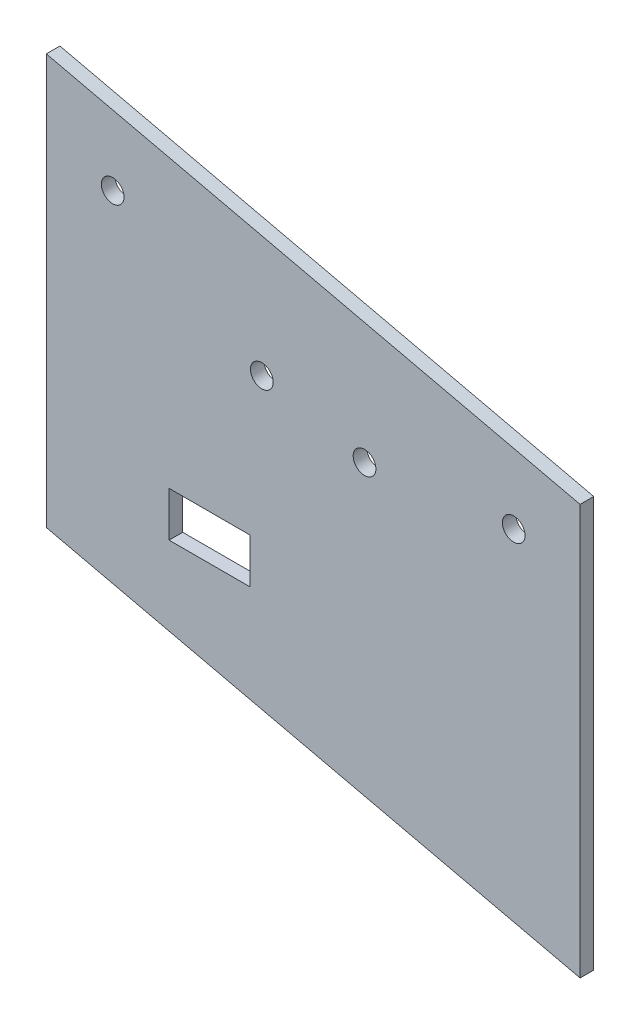
ISO-10303-21;
HEADER;
FILE_DESCRIPTION(('STEP AP214'),'2;1');
FILE_NAME('part.step','',(''),(''),'','','');
FILE_SCHEMA(('AUTOMOTIVE_DESIGN { 1 0 10303 214 1 1 1 1 }'));
ENDSEC;
DATA;
#1=APPLICATION_CONTEXT('core data for automotive mechanical design processes');
#2=APPLICATION_PROTOCOL_DEFINITION('international standard','automotive_design',2000,#1);
#3=PRODUCT_CONTEXT('',#1,'mechanical');
#4=PRODUCT('Part','Part','',(#3));
#5=PRODUCT_RELATED_PRODUCT_CATEGORY('part','',(#4));
#6=PRODUCT_DEFINITION_FORMATION('','',#4);
#7=PRODUCT_DEFINITION_CONTEXT('part definition',#1,'design');
#8=PRODUCT_DEFINITION('design','',#6,#7);
#9=PRODUCT_DEFINITION_SHAPE('','',#8);
#10=(LENGTH_UNIT() NAMED_UNIT(*) SI_UNIT(.MILLI.,.METRE.));
#11=(NAMED_UNIT(*) PLANE_ANGLE_UNIT() SI_UNIT($,.RADIAN.));
#12=(NAMED_UNIT(*) SI_UNIT($,.STERADIAN.) SOLID_ANGLE_UNIT());
#13=UNCERTAINTY_MEASURE_WITH_UNIT(LENGTH_MEASURE(1.E-05),#10,'distance_accuracy_value','');
#14=(GEOMETRIC_REPRESENTATION_CONTEXT(3) GLOBAL_UNCERTAINTY_ASSIGNED_CONTEXT((#13)) GLOBAL_UNIT_ASSIGNED_CONTEXT((#10,
#11,#12)) REPRESENTATION_CONTEXT('',''));
#15=CARTESIAN_POINT('',(0.,0.,0.));
#16=DIRECTION('',(0.,0.,1.));
#17=DIRECTION('',(1.,0.,0.));
#18=AXIS2_PLACEMENT_3D('',#15,#16,#17);
#19=CARTESIAN_POINT('',(117.509029813099,63.1709028461303,3.));
#20=DIRECTION('',(-0.224951054343861,-0.974370064785236,0.));
#21=DIRECTION('',(0.974370064785236,-0.224951054343861,0.));
#22=AXIS2_PLACEMENT_3D('',#19,#20,#21);
#23=PLANE('',#22);
#24=DIRECTION('',(-0.974370064785236,0.224951054343861,0.));
#25=VECTOR('',#24,1.);
#26=CARTESIAN_POINT('',(117.509029813099,63.1709028461303,0.));
#27=LINE('',#26,#25);
#28=CARTESIAN_POINT('',(117.509029813099,63.1709028461303,0.));
#29=VERTEX_POINT('',#28);
#30=CARTESIAN_POINT('',(0.,90.3,0.));
#31=VERTEX_POINT('',#30);
#32=EDGE_CURVE('E163',#29,#31,#27,.T.);
#33=ORIENTED_EDGE('',*,*,#32,.T.);
#34=DIRECTION('',(0.,0.,-1.));
#35=VECTOR('',#34,1.);
#36=CARTESIAN_POINT('',(0.,90.3,3.));
#37=LINE('',#36,#35);
#38=CARTESIAN_POINT('',(0.,90.3,3.));
#39=VERTEX_POINT('',#38);
#40=EDGE_CURVE('E11',#39,#31,#37,.T.);
#41=ORIENTED_EDGE('',*,*,#40,.F.);
#42=DIRECTION('',(-0.974370064785236,0.224951054343861,0.));
#43=VECTOR('',#42,1.);
#44=CARTESIAN_POINT('',(117.509029813099,63.1709028461303,3.));
#45=LINE('',#44,#43);
#46=CARTESIAN_POINT('',(117.509029813099,63.1709028461303,3.));
#47=VERTEX_POINT('',#46);
#48=EDGE_CURVE('E164',#47,#39,#45,.T.);
#49=ORIENTED_EDGE('',*,*,#48,.F.);
#50=DIRECTION('',(0.,0.,-1.));
#51=VECTOR('',#50,1.);
#52=CARTESIAN_POINT('',(117.509029813099,63.1709028461303,3.));
#53=LINE('',#52,#51);
#54=EDGE_CURVE('E174',#47,#29,#53,.T.);
#55=ORIENTED_EDGE('',*,*,#54,.T.);
#56=EDGE_LOOP('',(#33,#41,#49,#55));
#57=FACE_BOUND('',#56,.T.);
#58=ADVANCED_FACE('F39',(#57),#23,.F.);
#59=CARTESIAN_POINT('',(0.,90.3,3.));
#60=DIRECTION('',(1.,0.,0.));
#61=DIRECTION('',(0.,1.,0.));
#62=AXIS2_PLACEMENT_3D('',#59,#60,#61);
#63=PLANE('',#62);
#64=DIRECTION('',(0.,-1.,0.));
#65=VECTOR('',#64,1.);
#66=CARTESIAN_POINT('',(0.,90.3,0.));
#67=LINE('',#66,#65);
#68=CARTESIAN_POINT('',(0.,0.,0.));
#69=VERTEX_POINT('',#68);
#70=EDGE_CURVE('E177',#31,#69,#67,.T.);
#71=ORIENTED_EDGE('',*,*,#70,.T.);
#72=DIRECTION('',(0.,0.,-1.));
#73=VECTOR('',#72,1.);
#74=CARTESIAN_POINT('',(0.,0.,3.));
#75=LINE('',#74,#73);
#76=CARTESIAN_POINT('',(0.,0.,3.));
#77=VERTEX_POINT('',#76);
#78=EDGE_CURVE('E46',#77,#69,#75,.T.);
#79=ORIENTED_EDGE('',*,*,#78,.F.);
#80=DIRECTION('',(0.,-1.,0.));
#81=VECTOR('',#80,1.);
#82=CARTESIAN_POINT('',(0.,90.3,3.));
#83=LINE('',#82,#81);
#84=EDGE_CURVE('E167',#39,#77,#83,.T.);
#85=ORIENTED_EDGE('',*,*,#84,.F.);
#86=ORIENTED_EDGE('',*,*,#40,.T.);
#87=EDGE_LOOP('',(#71,#79,#85,#86));
#88=FACE_BOUND('',#87,.T.);
#89=ADVANCED_FACE('F206',(#88),#63,.F.);
#90=CARTESIAN_POINT('',(0.,0.,3.));
#91=DIRECTION('',(0.224951054343861,0.974370064785236,0.));
#92=DIRECTION('',(-0.974370064785236,0.224951054343861,0.));
#93=AXIS2_PLACEMENT_3D('',#90,#91,#92);
#94=PLANE('',#93);
#95=DIRECTION('',(0.974370064785236,-0.224951054343861,0.));
#96=VECTOR('',#95,1.);
#97=CARTESIAN_POINT('',(0.,0.,0.));
#98=LINE('',#97,#96);
#99=CARTESIAN_POINT('',(117.509029813099,-27.1290971538697,0.));
#100=VERTEX_POINT('',#99);
#101=EDGE_CURVE('E179',#69,#100,#98,.T.);
#102=ORIENTED_EDGE('',*,*,#101,.T.);
#103=DIRECTION('',(0.,0.,-1.));
#104=VECTOR('',#103,1.);
#105=CARTESIAN_POINT('',(117.509029813099,-27.1290971538697,3.));
#106=LINE('',#105,#104);
#107=CARTESIAN_POINT('',(117.509029813099,-27.1290971538697,3.));
#108=VERTEX_POINT('',#107);
#109=EDGE_CURVE('E184',#108,#100,#106,.T.);
#110=ORIENTED_EDGE('',*,*,#109,.F.);
#111=DIRECTION('',(0.974370064785236,-0.224951054343861,0.));
#112=VECTOR('',#111,1.);
#113=CARTESIAN_POINT('',(0.,0.,3.));
#114=LINE('',#113,#112);
#115=EDGE_CURVE('E170',#77,#108,#114,.T.);
#116=ORIENTED_EDGE('',*,*,#115,.F.);
#117=ORIENTED_EDGE('',*,*,#78,.T.);
#118=EDGE_LOOP('',(#102,#110,#116,#117));
#119=FACE_BOUND('',#118,.T.);
#120=ADVANCED_FACE('F191',(#119),#94,.F.);
#121=CARTESIAN_POINT('',(117.509029813099,-27.1290971538697,3.));
#122=DIRECTION('',(-1.,0.,0.));
#123=DIRECTION('',(0.,0.,1.));
#124=AXIS2_PLACEMENT_3D('',#121,#122,#123);
#125=PLANE('',#124);
#126=DIRECTION('',(0.,1.,0.));
#127=VECTOR('',#126,1.);
#128=CARTESIAN_POINT('',(117.509029813099,-27.1290971538697,0.));
#129=LINE('',#128,#127);
#130=EDGE_CURVE('E168',#100,#29,#129,.T.);
#131=ORIENTED_EDGE('',*,*,#130,.T.);
#132=ORIENTED_EDGE('',*,*,#54,.F.);
#133=DIRECTION('',(0.,1.,0.));
#134=VECTOR('',#133,1.);
#135=CARTESIAN_POINT('',(117.509029813099,-27.1290971538697,3.));
#136=LINE('',#135,#134);
#137=EDGE_CURVE('E172',#108,#47,#136,.T.);
#138=ORIENTED_EDGE('',*,*,#137,.F.);
#139=ORIENTED_EDGE('',*,*,#109,.T.);
#140=EDGE_LOOP('',(#131,#132,#138,#139));
#141=FACE_BOUND('',#140,.T.);
#142=ADVANCED_FACE('F199',(#141),#125,.F.);
#143=CARTESIAN_POINT('',(0.,0.,3.));
#144=DIRECTION('',(0.,0.,1.));
#145=DIRECTION('',(1.,0.,0.));
#146=AXIS2_PLACEMENT_3D('',#143,#144,#145);
#147=PLANE('',#146);
#148=DIRECTION('',(0.,-1.,0.));
#149=VECTOR('',#148,1.);
#150=CARTESIAN_POINT('',(27.0302224706842,11.1103341111418,3.));
#151=LINE('',#150,#149);
#152=CARTESIAN_POINT('',(27.0302224706842,20.9837108386305,3.));
#153=VERTEX_POINT('',#152);
#154=CARTESIAN_POINT('',(27.0302224706842,11.1103341111418,3.));
#155=VERTEX_POINT('',#154);
#156=EDGE_CURVE('E53',#153,#155,#151,.T.);
#157=ORIENTED_EDGE('',*,*,#156,.F.);
#158=DIRECTION('',(-1.,0.,0.));
#159=VECTOR('',#158,1.);
#160=CARTESIAN_POINT('',(27.0302224706842,20.9837108386305,3.));
#161=LINE('',#160,#159);
#162=CARTESIAN_POINT('',(44.8346723071393,20.9837108386305,3.));
#163=VERTEX_POINT('',#162);
#164=EDGE_CURVE('E121',#163,#153,#161,.T.);
#165=ORIENTED_EDGE('',*,*,#164,.F.);
#166=DIRECTION('',(0.,1.,0.));
#167=VECTOR('',#166,1.);
#168=CARTESIAN_POINT('',(44.8346723071393,11.1103341111418,3.));
#169=LINE('',#168,#167);
#170=CARTESIAN_POINT('',(44.8346723071393,11.1103341111418,3.));
#171=VERTEX_POINT('',#170);
#172=EDGE_CURVE('E124',#171,#163,#169,.T.);
#173=ORIENTED_EDGE('',*,*,#172,.F.);
#174=DIRECTION('',(1.,0.,0.));
#175=VECTOR('',#174,1.);
#176=CARTESIAN_POINT('',(27.0302224706842,11.1103341111418,3.));
#177=LINE('',#176,#175);
#178=EDGE_CURVE('E130',#155,#171,#177,.T.);
#179=ORIENTED_EDGE('',*,*,#178,.F.);
#180=EDGE_LOOP('',(#157,#165,#173,#179));
#181=FACE_BOUND('',#180,.T.);
#182=CARTESIAN_POINT('',(14.6155509717785,71.5311725679412,3.));
#183=DIRECTION('',(0.,0.,1.));
#184=DIRECTION('',(1.,0.,0.));
#185=AXIS2_PLACEMENT_3D('',#182,#183,#184);
#186=CIRCLE('',#185,2.49999999999999);
#187=CARTESIAN_POINT('',(17.1155509717785,71.5311725679412,3.));
#188=VERTEX_POINT('',#187);
#189=EDGE_CURVE('E136',#188,#188,#186,.T.);
#190=ORIENTED_EDGE('',*,*,#189,.F.);
#191=EDGE_LOOP('',(#190));
#192=FACE_BOUND('',#191,.T.);
#193=CARTESIAN_POINT('',(102.893478841321,51.1506070443874,3.));
#194=DIRECTION('',(0.,0.,1.));
#195=DIRECTION('',(1.,0.,0.));
#196=AXIS2_PLACEMENT_3D('',#193,#194,#195);
#197=CIRCLE('',#196,2.49999999999999);
#198=CARTESIAN_POINT('',(105.393478841321,51.1506070443874,3.));
#199=VERTEX_POINT('',#198);
#200=EDGE_CURVE('E145',#199,#199,#197,.T.);
#201=ORIENTED_EDGE('',*,*,#200,.F.);
#202=EDGE_LOOP('',(#201));
#203=FACE_BOUND('',#202,.T.);
#204=CARTESIAN_POINT('',(70.0572076580585,47.4421123900482,3.));
#205=DIRECTION('',(0.,0.,1.));
#206=DIRECTION('',(1.,0.,0.));
#207=AXIS2_PLACEMENT_3D('',#204,#205,#206);
#208=CIRCLE('',#207,2.49999999999999);
#209=CARTESIAN_POINT('',(72.5572076580585,47.4421123900482,3.));
#210=VERTEX_POINT('',#209);
#211=EDGE_CURVE('E151',#210,#210,#208,.T.);
#212=ORIENTED_EDGE('',*,*,#211,.F.);
#213=EDGE_LOOP('',(#212));
#214=FACE_BOUND('',#213,.T.);
#215=CARTESIAN_POINT('',(47.451822155041,52.6609768508258,3.));
#216=DIRECTION('',(0.,0.,1.));
#217=DIRECTION('',(1.,0.,0.));
#218=AXIS2_PLACEMENT_3D('',#215,#216,#217);
#219=CIRCLE('',#218,2.49999999999999);
#220=CARTESIAN_POINT('',(49.951822155041,52.6609768508258,3.));
#221=VERTEX_POINT('',#220);
#222=EDGE_CURVE('E157',#221,#221,#219,.T.);
#223=ORIENTED_EDGE('',*,*,#222,.F.);
#224=EDGE_LOOP('',(#223));
#225=FACE_BOUND('',#224,.T.);
#226=ORIENTED_EDGE('',*,*,#48,.T.);
#227=ORIENTED_EDGE('',*,*,#84,.T.);
#228=ORIENTED_EDGE('',*,*,#115,.T.);
#229=ORIENTED_EDGE('',*,*,#137,.T.);
#230=EDGE_LOOP('',(#226,#227,#228,#229));
#231=FACE_BOUND('',#230,.T.);
#232=ADVANCED_FACE('F205',(#181,#192,#203,#214,#225,#231),#147,.T.);
#233=CARTESIAN_POINT('',(0.,0.,0.));
#234=DIRECTION('',(0.,0.,1.));
#235=DIRECTION('',(1.,0.,0.));
#236=AXIS2_PLACEMENT_3D('',#233,#234,#235);
#237=PLANE('',#236);
#238=DIRECTION('',(-1.,0.,0.));
#239=VECTOR('',#238,1.);
#240=CARTESIAN_POINT('',(27.0302224706842,20.9837108386305,0.));
#241=LINE('',#240,#239);
#242=CARTESIAN_POINT('',(44.8346723071393,20.9837108386305,0.));
#243=VERTEX_POINT('',#242);
#244=CARTESIAN_POINT('',(27.0302224706842,20.9837108386305,0.));
#245=VERTEX_POINT('',#244);
#246=EDGE_CURVE('E111',#243,#245,#241,.T.);
#247=ORIENTED_EDGE('',*,*,#246,.T.);
#248=DIRECTION('',(0.,-1.,0.));
#249=VECTOR('',#248,1.);
#250=CARTESIAN_POINT('',(27.0302224706842,11.1103341111418,0.));
#251=LINE('',#250,#249);
#252=CARTESIAN_POINT('',(27.0302224706842,11.1103341111418,0.));
#253=VERTEX_POINT('',#252);
#254=EDGE_CURVE('E105',#245,#253,#251,.T.);
#255=ORIENTED_EDGE('',*,*,#254,.T.);
#256=DIRECTION('',(1.,0.,0.));
#257=VECTOR('',#256,1.);
#258=CARTESIAN_POINT('',(27.0302224706842,11.1103341111418,0.));
#259=LINE('',#258,#257);
#260=CARTESIAN_POINT('',(44.8346723071393,11.1103341111418,0.));
#261=VERTEX_POINT('',#260);
#262=EDGE_CURVE('E114',#253,#261,#259,.T.);
#263=ORIENTED_EDGE('',*,*,#262,.T.);
#264=DIRECTION('',(0.,1.,0.));
#265=VECTOR('',#264,1.);
#266=CARTESIAN_POINT('',(44.8346723071393,11.1103341111418,0.));
#267=LINE('',#266,#265);
#268=EDGE_CURVE('E61',#261,#243,#267,.T.);
#269=ORIENTED_EDGE('',*,*,#268,.T.);
#270=EDGE_LOOP('',(#247,#255,#263,#269));
#271=FACE_BOUND('',#270,.T.);
#272=CARTESIAN_POINT('',(14.6155509717785,71.5311725679412,0.));
#273=DIRECTION('',(0.,0.,1.));
#274=DIRECTION('',(1.,0.,0.));
#275=AXIS2_PLACEMENT_3D('',#272,#273,#274);
#276=CIRCLE('',#275,2.5);
#277=CARTESIAN_POINT('',(17.1155509717785,71.5311725679412,0.));
#278=VERTEX_POINT('',#277);
#279=EDGE_CURVE('E142',#278,#278,#276,.T.);
#280=ORIENTED_EDGE('',*,*,#279,.T.);
#281=EDGE_LOOP('',(#280));
#282=FACE_BOUND('',#281,.T.);
#283=CARTESIAN_POINT('',(102.893478841321,51.1506070443874,0.));
#284=DIRECTION('',(0.,0.,1.));
#285=DIRECTION('',(1.,0.,0.));
#286=AXIS2_PLACEMENT_3D('',#283,#284,#285);
#287=CIRCLE('',#286,2.5);
#288=CARTESIAN_POINT('',(105.393478841321,51.1506070443874,0.));
#289=VERTEX_POINT('',#288);
#290=EDGE_CURVE('E148',#289,#289,#287,.T.);
#291=ORIENTED_EDGE('',*,*,#290,.T.);
#292=EDGE_LOOP('',(#291));
#293=FACE_BOUND('',#292,.T.);
#294=CARTESIAN_POINT('',(70.0572076580585,47.4421123900482,0.));
#295=DIRECTION('',(0.,0.,1.));
#296=DIRECTION('',(1.,0.,0.));
#297=AXIS2_PLACEMENT_3D('',#294,#295,#296);
#298=CIRCLE('',#297,2.5);
#299=CARTESIAN_POINT('',(72.5572076580585,47.4421123900482,0.));
#300=VERTEX_POINT('',#299);
#301=EDGE_CURVE('E154',#300,#300,#298,.T.);
#302=ORIENTED_EDGE('',*,*,#301,.T.);
#303=EDGE_LOOP('',(#302));
#304=FACE_BOUND('',#303,.T.);
#305=CARTESIAN_POINT('',(47.451822155041,52.6609768508258,0.));
#306=DIRECTION('',(0.,0.,1.));
#307=DIRECTION('',(1.,0.,0.));
#308=AXIS2_PLACEMENT_3D('',#305,#306,#307);
#309=CIRCLE('',#308,2.5);
#310=CARTESIAN_POINT('',(49.951822155041,52.6609768508258,0.));
#311=VERTEX_POINT('',#310);
#312=EDGE_CURVE('E160',#311,#311,#309,.T.);
#313=ORIENTED_EDGE('',*,*,#312,.T.);
#314=EDGE_LOOP('',(#313));
#315=FACE_BOUND('',#314,.T.);
#316=ORIENTED_EDGE('',*,*,#32,.F.);
#317=ORIENTED_EDGE('',*,*,#130,.F.);
#318=ORIENTED_EDGE('',*,*,#101,.F.);
#319=ORIENTED_EDGE('',*,*,#70,.F.);
#320=EDGE_LOOP('',(#316,#317,#318,#319));
#321=FACE_BOUND('',#320,.T.);
#322=ADVANCED_FACE('F118',(#271,#282,#293,#304,#315,#321),#237,.F.);
#323=CARTESIAN_POINT('',(47.451822155041,52.6609768508258,3.));
#324=DIRECTION('',(0.,0.,1.));
#325=DIRECTION('',(1.,0.,0.));
#326=AXIS2_PLACEMENT_3D('',#323,#324,#325);
#327=CYLINDRICAL_SURFACE('',#326,2.5);
#328=ORIENTED_EDGE('',*,*,#312,.F.);
#329=EDGE_LOOP('',(#328));
#330=FACE_BOUND('',#329,.T.);
#331=ORIENTED_EDGE('',*,*,#222,.T.);
#332=EDGE_LOOP('',(#331));
#333=FACE_BOUND('',#332,.T.);
#334=ADVANCED_FACE('F218',(#330,#333),#327,.F.);
#335=CARTESIAN_POINT('',(70.0572076580585,47.4421123900482,3.));
#336=DIRECTION('',(0.,0.,1.));
#337=DIRECTION('',(1.,0.,0.));
#338=AXIS2_PLACEMENT_3D('',#335,#336,#337);
#339=CYLINDRICAL_SURFACE('',#338,2.5);
#340=ORIENTED_EDGE('',*,*,#301,.F.);
#341=EDGE_LOOP('',(#340));
#342=FACE_BOUND('',#341,.T.);
#343=ORIENTED_EDGE('',*,*,#211,.T.);
#344=EDGE_LOOP('',(#343));
#345=FACE_BOUND('',#344,.T.);
#346=ADVANCED_FACE('F224',(#342,#345),#339,.F.);
#347=CARTESIAN_POINT('',(102.893478841321,51.1506070443874,3.));
#348=DIRECTION('',(0.,0.,1.));
#349=DIRECTION('',(1.,0.,0.));
#350=AXIS2_PLACEMENT_3D('',#347,#348,#349);
#351=CYLINDRICAL_SURFACE('',#350,2.5);
#352=ORIENTED_EDGE('',*,*,#290,.F.);
#353=EDGE_LOOP('',(#352));
#354=FACE_BOUND('',#353,.T.);
#355=ORIENTED_EDGE('',*,*,#200,.T.);
#356=EDGE_LOOP('',(#355));
#357=FACE_BOUND('',#356,.T.);
#358=ADVANCED_FACE('F228',(#354,#357),#351,.F.);
#359=CARTESIAN_POINT('',(14.6155509717785,71.5311725679412,3.));
#360=DIRECTION('',(0.,0.,1.));
#361=DIRECTION('',(1.,0.,0.));
#362=AXIS2_PLACEMENT_3D('',#359,#360,#361);
#363=CYLINDRICAL_SURFACE('',#362,2.49999999999999);
#364=ORIENTED_EDGE('',*,*,#279,.F.);
#365=EDGE_LOOP('',(#364));
#366=FACE_BOUND('',#365,.T.);
#367=ORIENTED_EDGE('',*,*,#189,.T.);
#368=EDGE_LOOP('',(#367));
#369=FACE_BOUND('',#368,.T.);
#370=ADVANCED_FACE('F232',(#366,#369),#363,.F.);
#371=CARTESIAN_POINT('',(27.0302224706842,11.1103341111418,0.));
#372=DIRECTION('',(-1.,0.,0.));
#373=DIRECTION('',(0.,0.,1.));
#374=AXIS2_PLACEMENT_3D('',#371,#372,#373);
#375=PLANE('',#374);
#376=ORIENTED_EDGE('',*,*,#156,.T.);
#377=DIRECTION('',(0.,0.,1.));
#378=VECTOR('',#377,1.);
#379=CARTESIAN_POINT('',(27.0302224706842,11.1103341111418,0.));
#380=LINE('',#379,#378);
#381=EDGE_CURVE('E101',#253,#155,#380,.T.);
#382=ORIENTED_EDGE('',*,*,#381,.F.);
#383=ORIENTED_EDGE('',*,*,#254,.F.);
#384=DIRECTION('',(0.,0.,1.));
#385=VECTOR('',#384,1.);
#386=CARTESIAN_POINT('',(27.0302224706842,20.9837108386305,0.));
#387=LINE('',#386,#385);
#388=EDGE_CURVE('E134',#245,#153,#387,.T.);
#389=ORIENTED_EDGE('',*,*,#388,.T.);
#390=EDGE_LOOP('',(#376,#382,#383,#389));
#391=FACE_BOUND('',#390,.T.);
#392=ADVANCED_FACE('F103',(#391),#375,.F.);
#393=CARTESIAN_POINT('',(27.0302224706842,20.9837108386305,0.));
#394=DIRECTION('',(0.,1.,0.));
#395=DIRECTION('',(0.,0.,1.));
#396=AXIS2_PLACEMENT_3D('',#393,#394,#395);
#397=PLANE('',#396);
#398=ORIENTED_EDGE('',*,*,#164,.T.);
#399=ORIENTED_EDGE('',*,*,#388,.F.);
#400=ORIENTED_EDGE('',*,*,#246,.F.);
#401=DIRECTION('',(0.,0.,1.));
#402=VECTOR('',#401,1.);
#403=CARTESIAN_POINT('',(44.8346723071393,20.9837108386305,0.));
#404=LINE('',#403,#402);
#405=EDGE_CURVE('E137',#243,#163,#404,.T.);
#406=ORIENTED_EDGE('',*,*,#405,.T.);
#407=EDGE_LOOP('',(#398,#399,#400,#406));
#408=FACE_BOUND('',#407,.T.);
#409=ADVANCED_FACE('F239',(#408),#397,.F.);
#410=CARTESIAN_POINT('',(44.8346723071393,11.1103341111418,0.));
#411=DIRECTION('',(1.,0.,0.));
#412=DIRECTION('',(0.,0.,-1.));
#413=AXIS2_PLACEMENT_3D('',#410,#411,#412);
#414=PLANE('',#413);
#415=ORIENTED_EDGE('',*,*,#172,.T.);
#416=ORIENTED_EDGE('',*,*,#405,.F.);
#417=ORIENTED_EDGE('',*,*,#268,.F.);
#418=DIRECTION('',(0.,0.,1.));
#419=VECTOR('',#418,1.);
#420=CARTESIAN_POINT('',(44.8346723071393,11.1103341111418,0.));
#421=LINE('',#420,#419);
#422=EDGE_CURVE('E110',#261,#171,#421,.T.);
#423=ORIENTED_EDGE('',*,*,#422,.T.);
#424=EDGE_LOOP('',(#415,#416,#417,#423));
#425=FACE_BOUND('',#424,.T.);
#426=ADVANCED_FACE('F242',(#425),#414,.F.);
#427=CARTESIAN_POINT('',(27.0302224706842,11.1103341111418,0.));
#428=DIRECTION('',(0.,-1.,0.));
#429=DIRECTION('',(0.,0.,-1.));
#430=AXIS2_PLACEMENT_3D('',#427,#428,#429);
#431=PLANE('',#430);
#432=ORIENTED_EDGE('',*,*,#178,.T.);
#433=ORIENTED_EDGE('',*,*,#422,.F.);
#434=ORIENTED_EDGE('',*,*,#262,.F.);
#435=ORIENTED_EDGE('',*,*,#381,.T.);
#436=EDGE_LOOP('',(#432,#433,#434,#435));
#437=FACE_BOUND('',#436,.T.);
#438=ADVANCED_FACE('F115',(#437),#431,.F.);
#439=CLOSED_SHELL('',(#58,#89,#120,#142,#232,#322,#334,#346,#358,#370,#392,#409,#426,#438));
#440=MANIFOLD_SOLID_BREP('B2',#439);
#441=ADVANCED_BREP_SHAPE_REPRESENTATION('',(#18,#440),#14);
#442=SHAPE_DEFINITION_REPRESENTATION(#9,#441);
ENDSEC;
END-ISO-10303-21;
